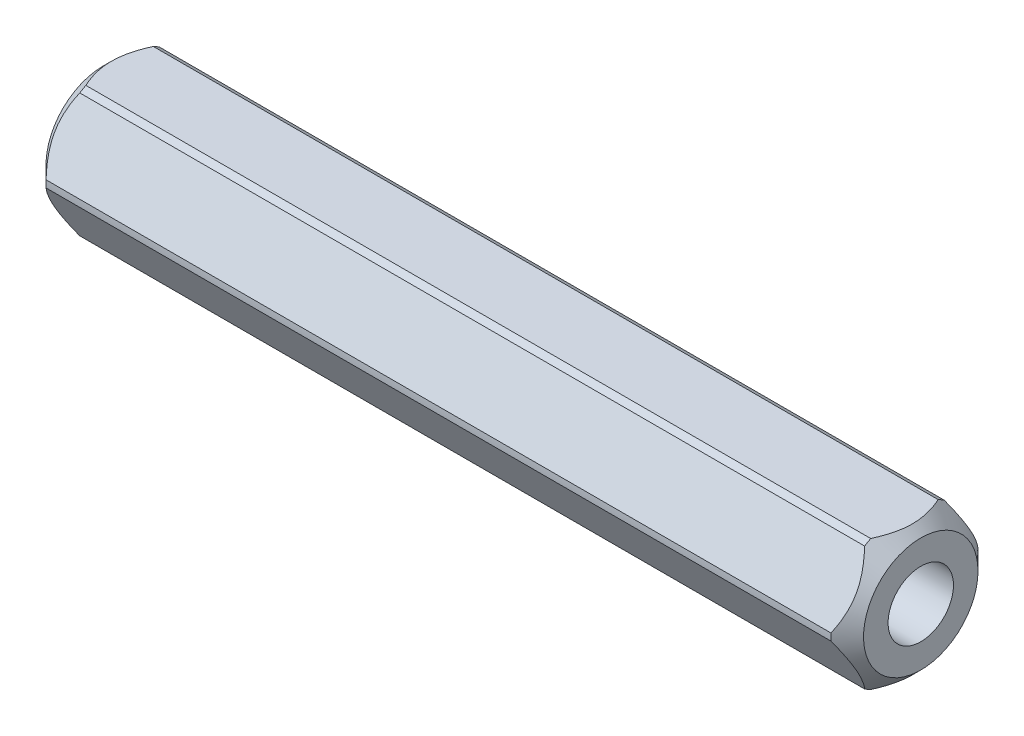
ISO-10303-21;
HEADER;
FILE_DESCRIPTION(('STEP AP214'),'2;1');
FILE_NAME('part.step','',(''),(''),'','','');
FILE_SCHEMA(('AUTOMOTIVE_DESIGN { 1 0 10303 214 1 1 1 1 }'));
ENDSEC;
DATA;
#1=APPLICATION_CONTEXT('core data for automotive mechanical design processes');
#2=APPLICATION_PROTOCOL_DEFINITION('international standard','automotive_design',2000,#1);
#3=PRODUCT_CONTEXT('',#1,'mechanical');
#4=PRODUCT('Part','Part','',(#3));
#5=PRODUCT_RELATED_PRODUCT_CATEGORY('part','',(#4));
#6=PRODUCT_DEFINITION_FORMATION('','',#4);
#7=PRODUCT_DEFINITION_CONTEXT('part definition',#1,'design');
#8=PRODUCT_DEFINITION('design','',#6,#7);
#9=PRODUCT_DEFINITION_SHAPE('','',#8);
#10=(LENGTH_UNIT() NAMED_UNIT(*) SI_UNIT(.MILLI.,.METRE.));
#11=(NAMED_UNIT(*) PLANE_ANGLE_UNIT() SI_UNIT($,.RADIAN.));
#12=(NAMED_UNIT(*) SI_UNIT($,.STERADIAN.) SOLID_ANGLE_UNIT());
#13=UNCERTAINTY_MEASURE_WITH_UNIT(LENGTH_MEASURE(1.E-05),#10,'distance_accuracy_value','');
#14=(GEOMETRIC_REPRESENTATION_CONTEXT(3) GLOBAL_UNCERTAINTY_ASSIGNED_CONTEXT((#13)) GLOBAL_UNIT_ASSIGNED_CONTEXT((#10,
#11,#12)) REPRESENTATION_CONTEXT('',''));
#15=CARTESIAN_POINT('',(0.,0.,0.));
#16=DIRECTION('',(0.,0.,1.));
#17=DIRECTION('',(1.,0.,0.));
#18=AXIS2_PLACEMENT_3D('',#15,#16,#17);
#19=CARTESIAN_POINT('',(25.,0.,0.));
#20=DIRECTION('',(1.,0.,0.));
#21=DIRECTION('',(0.,0.,-1.));
#22=AXIS2_PLACEMENT_3D('',#19,#20,#21);
#23=PLANE('',#22);
#24=CARTESIAN_POINT('',(25.,0.,0.));
#25=DIRECTION('',(1.,0.,0.));
#26=DIRECTION('',(0.,0.,-1.));
#27=AXIS2_PLACEMENT_3D('',#24,#25,#26);
#28=CIRCLE('',#27,2.);
#29=CARTESIAN_POINT('',(25.,0.,-2.));
#30=VERTEX_POINT('',#29);
#31=EDGE_CURVE('E190',#30,#30,#28,.T.);
#32=ORIENTED_EDGE('',*,*,#31,.F.);
#33=EDGE_LOOP('',(#32));
#34=FACE_BOUND('',#33,.T.);
#35=CARTESIAN_POINT('',(25.,0.,0.));
#36=DIRECTION('',(1.,0.,0.));
#37=DIRECTION('',(0.,0.,-1.));
#38=AXIS2_PLACEMENT_3D('',#35,#36,#37);
#39=CIRCLE('',#38,3.50000000000001);
#40=CARTESIAN_POINT('',(25.,0.,-3.50000000000001));
#41=VERTEX_POINT('',#40);
#42=EDGE_CURVE('E300',#41,#41,#39,.F.);
#43=ORIENTED_EDGE('',*,*,#42,.F.);
#44=EDGE_LOOP('',(#43));
#45=FACE_BOUND('',#44,.T.);
#46=ADVANCED_FACE('F34',(#34,#45),#23,.T.);
#47=CARTESIAN_POINT('',(-25.,0.,0.));
#48=DIRECTION('',(1.,0.,0.));
#49=DIRECTION('',(0.,0.,-1.));
#50=AXIS2_PLACEMENT_3D('',#47,#48,#49);
#51=PLANE('',#50);
#52=CARTESIAN_POINT('',(-25.,0.,0.));
#53=DIRECTION('',(1.,0.,0.));
#54=DIRECTION('',(0.,0.,-1.));
#55=AXIS2_PLACEMENT_3D('',#52,#53,#54);
#56=CIRCLE('',#55,3.5);
#57=CARTESIAN_POINT('',(-25.,0.,-3.5));
#58=VERTEX_POINT('',#57);
#59=EDGE_CURVE('E272',#58,#58,#56,.F.);
#60=ORIENTED_EDGE('',*,*,#59,.T.);
#61=EDGE_LOOP('',(#60));
#62=FACE_BOUND('',#61,.T.);
#63=CARTESIAN_POINT('',(-25.,0.,0.));
#64=DIRECTION('',(1.,0.,0.));
#65=DIRECTION('',(0.,0.,-1.));
#66=AXIS2_PLACEMENT_3D('',#63,#64,#65);
#67=CIRCLE('',#66,2.);
#68=CARTESIAN_POINT('',(-25.,0.,-2.));
#69=VERTEX_POINT('',#68);
#70=EDGE_CURVE('E187',#69,#69,#67,.T.);
#71=ORIENTED_EDGE('',*,*,#70,.T.);
#72=EDGE_LOOP('',(#71));
#73=FACE_BOUND('',#72,.T.);
#74=ADVANCED_FACE('F320',(#62,#73),#51,.F.);
#75=CARTESIAN_POINT('',(-25.,0.,0.));
#76=DIRECTION('',(1.,0.,0.));
#77=DIRECTION('',(0.,0.,-1.));
#78=AXIS2_PLACEMENT_3D('',#75,#76,#77);
#79=CYLINDRICAL_SURFACE('',#78,2.);
#80=ORIENTED_EDGE('',*,*,#70,.F.);
#81=EDGE_LOOP('',(#80));
#82=FACE_BOUND('',#81,.T.);
#83=ORIENTED_EDGE('',*,*,#31,.T.);
#84=EDGE_LOOP('',(#83));
#85=FACE_BOUND('',#84,.T.);
#86=ADVANCED_FACE('F339',(#82,#85),#79,.F.);
#87=CARTESIAN_POINT('',(24.,0.,0.));
#88=DIRECTION('',(-1.,0.,0.));
#89=DIRECTION('',(0.,0.,1.));
#90=AXIS2_PLACEMENT_3D('',#87,#88,#89);
#91=CONICAL_SURFACE('',#90,4.5,0.785398163397449);
#92=ORIENTED_EDGE('',*,*,#42,.T.);
#93=EDGE_LOOP('',(#92));
#94=FACE_BOUND('',#93,.T.);
#95=CARTESIAN_POINT('',(24.,0.,0.));
#96=DIRECTION('',(1.,0.,0.));
#97=DIRECTION('',(0.,0.,-1.));
#98=AXIS2_PLACEMENT_3D('',#95,#96,#97);
#99=CIRCLE('',#98,4.5);
#100=CARTESIAN_POINT('',(24.,-0.214642892864286,-4.49487802154217));
#101=VERTEX_POINT('',#100);
#102=CARTESIAN_POINT('',(24.,0.214642892864287,-4.49487802154217));
#103=VERTEX_POINT('',#102);
#104=EDGE_CURVE('E121',#101,#103,#99,.T.);
#105=ORIENTED_EDGE('',*,*,#104,.T.);
#106=CARTESIAN_POINT('',(23.9998941963782,3.78555710713571,-2.4332097386795));
#107=CARTESIAN_POINT('',(24.0664192825533,3.65976455759794,-2.50583610101718));
#108=CARTESIAN_POINT('',(24.1284859139684,3.53199462101411,-2.5796041082982));
#109=CARTESIAN_POINT('',(24.2410974501276,3.27212182868206,-2.72964173490617));
#110=CARTESIAN_POINT('',(24.2915930288924,3.14000307190182,-2.80592053469824));
#111=CARTESIAN_POINT('',(24.3772964035166,2.87383811958494,-2.95959094156723));
#112=CARTESIAN_POINT('',(24.4126929780641,2.73983876216137,-3.03695550664697));
#113=CARTESIAN_POINT('',(24.4663535308738,2.46946450383406,-3.19305615747418));
#114=CARTESIAN_POINT('',(24.4846469548417,2.33309409902488,-3.27178964740027));
#115=CARTESIAN_POINT('',(24.5018229694783,2.07015756383123,-3.42359612677411));
#116=CARTESIAN_POINT('',(24.5021148581694,1.94366093843834,-3.49662898749627));
#117=CARTESIAN_POINT('',(24.486790759109,1.69133917664634,-3.64230702458928));
#118=CARTESIAN_POINT('',(24.4711663583711,1.56551443074427,-3.71495197550656));
#119=CARTESIAN_POINT('',(24.4252415067076,1.31593556235903,-3.85904640235282));
#120=CARTESIAN_POINT('',(24.3949407378895,1.19218148478694,-3.93049585235238));
#121=CARTESIAN_POINT('',(24.3216820791155,0.947508545186826,-4.07175783989392));
#122=CARTESIAN_POINT('',(24.2787190677524,0.826590851776383,-4.14156970273423));
#123=CARTESIAN_POINT('',(24.1967021799686,0.623423612931695,-4.25886836277172));
#124=CARTESIAN_POINT('',(24.160279052702,0.540358783642004,-4.30682586432232));
#125=CARTESIAN_POINT('',(24.0831422190421,0.376095613933446,-4.40166324957149));
#126=CARTESIAN_POINT('',(24.0424451392451,0.294891435546449,-4.44854650382255));
#127=CARTESIAN_POINT('',(23.9998941963782,0.214442892864286,-4.49499349159601));
#128=B_SPLINE_CURVE_WITH_KNOTS('',3,(#106,#107,#108,#109,#110,#111,#112,#113,#114,#115,#116,
#117,#118,#119,#120,#121,#122,#123,#124,#125,#126,#127),.UNSPECIFIED.,.F.,.F.,(4,2,2,2,2,2,2,2,
2,2,4),(0.,0.479542803803612,0.961093310814039,1.43643287483049,1.91095255343955,
2.34827188801426,2.78582249958598,3.22338258899905,3.66111989867402,3.96880795536116,
4.27534051498786),.UNSPECIFIED.);
#129=CARTESIAN_POINT('',(24.,3.78535710713571,-2.43332520873334));
#130=VERTEX_POINT('',#129);
#131=EDGE_CURVE('E57',#130,#103,#128,.T.);
#132=ORIENTED_EDGE('',*,*,#131,.F.);
#133=CARTESIAN_POINT('',(24.,0.,0.));
#134=DIRECTION('',(-1.,0.,0.));
#135=DIRECTION('',(0.,0.,1.));
#136=AXIS2_PLACEMENT_3D('',#133,#134,#135);
#137=CIRCLE('',#136,4.5);
#138=CARTESIAN_POINT('',(24.,4.,-2.06155281280883));
#139=VERTEX_POINT('',#138);
#140=EDGE_CURVE('E43',#130,#139,#137,.F.);
#141=ORIENTED_EDGE('',*,*,#140,.T.);
#142=CARTESIAN_POINT('',(22.6928649035894,4.,-4.2098477440359));
#143=CARTESIAN_POINT('',(22.7683322571427,4.,-4.10572300635101));
#144=CARTESIAN_POINT('',(22.842955360482,4.,-4.00097607923509));
#145=CARTESIAN_POINT('',(22.9901526416945,4.,-3.7900108242579));
#146=CARTESIAN_POINT('',(23.0627262455372,4.,-3.68379209634703));
#147=CARTESIAN_POINT('',(23.2059640207921,4.,-3.4689003193544));
#148=CARTESIAN_POINT('',(23.2766094903172,4.,-3.36021475308562));
#149=CARTESIAN_POINT('',(23.4148896517596,4.,-3.14095359873995));
#150=CARTESIAN_POINT('',(23.482524567128,4.,-3.03037815178074));
#151=CARTESIAN_POINT('',(23.617180182585,4.,-2.80193387204831));
#152=CARTESIAN_POINT('',(23.6840300855366,4.,-2.68396328072187));
#153=CARTESIAN_POINT('',(23.8128070383945,4.,-2.44537436143938));
#154=CARTESIAN_POINT('',(23.8747334149841,4.,-2.32475567421149));
#155=CARTESIAN_POINT('',(24.0510992209669,4.,-1.95915644375599));
#156=CARTESIAN_POINT('',(24.1566367860336,4.,-1.70959580749333));
#157=CARTESIAN_POINT('',(24.2861804137904,4.,-1.33029830953283));
#158=CARTESIAN_POINT('',(24.3241322220595,4.,-1.20530239351173));
#159=CARTESIAN_POINT('',(24.3899388223468,4.,-0.952617592005227));
#160=CARTESIAN_POINT('',(24.4177928432462,4.,-0.824928501642774));
#161=CARTESIAN_POINT('',(24.4615756990499,4.,-0.569582108969877));
#162=CARTESIAN_POINT('',(24.4776869406595,4.,-0.44195652322617));
#163=CARTESIAN_POINT('',(24.4977250643249,4.,-0.185747621111381));
#164=CARTESIAN_POINT('',(24.5016533980343,4.,-0.0571644206751611));
#165=CARTESIAN_POINT('',(24.4971333329479,4.,0.1965341551888));
#166=CARTESIAN_POINT('',(24.4889943727593,4.,0.321655254534301));
#167=CARTESIAN_POINT('',(24.4613980492696,4.,0.570635147563651));
#168=CARTESIAN_POINT('',(24.4419394954324,4.,0.694493807076177));
#169=CARTESIAN_POINT('',(24.3923658437765,4.,0.942141035988629));
#170=CARTESIAN_POINT('',(24.3620813749865,4.,1.06589520999821));
#171=CARTESIAN_POINT('',(24.2923567428542,4.,1.31074172841007));
#172=CARTESIAN_POINT('',(24.2529177446344,4.,1.43183440940288));
#173=CARTESIAN_POINT('',(24.1588827297649,4.,1.69187261628163));
#174=CARTESIAN_POINT('',(24.1028455828701,4.,1.83029292838178));
#175=CARTESIAN_POINT('',(23.9823220956594,4.,2.10343753165063));
#176=CARTESIAN_POINT('',(23.9178315177235,4.,2.23815992785214));
#177=CARTESIAN_POINT('',(23.7819524607804,4.,2.50462598235461));
#178=CARTESIAN_POINT('',(23.7105414224704,4.,2.63635804473519));
#179=CARTESIAN_POINT('',(23.5624164043816,4.,2.8967558561299));
#180=CARTESIAN_POINT('',(23.4857033362368,4.,3.02542212718707));
#181=CARTESIAN_POINT('',(23.3320679810562,4.,3.27361014613941));
#182=CARTESIAN_POINT('',(23.2553567000029,4.,3.39326320403362));
#183=CARTESIAN_POINT('',(23.0988200514308,4.,3.6305215763458));
#184=CARTESIAN_POINT('',(23.0189944430863,4.,3.74812673138176));
#185=CARTESIAN_POINT('',(22.8574721996124,4.,3.9805856203557));
#186=CARTESIAN_POINT('',(22.7757967520329,4.,4.09545412864817));
#187=CARTESIAN_POINT('',(22.6103690712587,4.,4.32363990413772));
#188=CARTESIAN_POINT('',(22.5266174093984,4.,4.4369575850589));
#189=CARTESIAN_POINT('',(22.4420197526138,4.,4.54962907034432));
#190=B_SPLINE_CURVE_WITH_KNOTS('',3,(#142,#143,#144,#145,#146,#147,#148,#149,#150,#151,#152,
#153,#154,#155,#156,#157,#158,#159,#160,#161,#162,#163,#164,#165,#166,#167,#168,#169,#170,#171,
#172,#173,#174,#175,#176,#177,#178,#179,#180,#181,#182,#183,#184,#185,#186,#187,#188,#189),
.UNSPECIFIED.,.F.,.F.,(4,2,2,2,2,2,2,2,2,2,2,2,2,2,2,2,2,2,2,2,2,2,2,4),(0.,0.385800042062577,
0.771707089606285,1.16054681927145,1.54935763997496,1.95602118677923,2.36274025152729,
3.17324409248814,3.56480527962876,3.95639636209757,4.34176689179923,4.7270915009388,
5.10270467711247,5.47835736547435,5.86016465451193,6.24192337648311,6.68956044955975,
7.13742278295025,7.58679758555163,8.03609531370603,8.46243387400676,8.88880546795715,
9.31161701408836,9.73431347454803),.UNSPECIFIED.);
#191=CARTESIAN_POINT('',(24.,4.,2.06155281280883));
#192=VERTEX_POINT('',#191);
#193=EDGE_CURVE('E140',#192,#139,#190,.F.);
#194=ORIENTED_EDGE('',*,*,#193,.F.);
#195=CARTESIAN_POINT('',(24.,3.78535710713571,2.43332520873334));
#196=VERTEX_POINT('',#195);
#197=EDGE_CURVE('E131',#192,#196,#99,.T.);
#198=ORIENTED_EDGE('',*,*,#197,.T.);
#199=CARTESIAN_POINT('',(23.9998941963782,0.214442892864283,4.49499349159601));
#200=CARTESIAN_POINT('',(24.0664192825533,0.340235442402051,4.42236712925833));
#201=CARTESIAN_POINT('',(24.1284859139684,0.468005378985888,4.34859912197731));
#202=CARTESIAN_POINT('',(24.2410974501276,0.727878171317938,4.19856149536934));
#203=CARTESIAN_POINT('',(24.2915930288924,0.859996928098178,4.12228269557727));
#204=CARTESIAN_POINT('',(24.3772964035166,1.12616188041506,3.96861228870828));
#205=CARTESIAN_POINT('',(24.4126929780641,1.26016123783863,3.89124772362854));
#206=CARTESIAN_POINT('',(24.4663535308738,1.53053549616594,3.73514707280132));
#207=CARTESIAN_POINT('',(24.4846469548417,1.66690590097513,3.65641358287524));
#208=CARTESIAN_POINT('',(24.5018229694783,1.92984243616878,3.5046071035014));
#209=CARTESIAN_POINT('',(24.5021148581694,2.05633906156166,3.43157424277924));
#210=CARTESIAN_POINT('',(24.486790759109,2.30866082335366,3.28589620568622));
#211=CARTESIAN_POINT('',(24.4711663583711,2.43448556925574,3.21325125476895));
#212=CARTESIAN_POINT('',(24.4252415067076,2.68406443764098,3.06915682792269));
#213=CARTESIAN_POINT('',(24.3949407378895,2.80781851521307,2.99770737792313));
#214=CARTESIAN_POINT('',(24.3216820791155,3.05249145481318,2.85644539038158));
#215=CARTESIAN_POINT('',(24.2787190677524,3.17340914822362,2.78663352754128));
#216=CARTESIAN_POINT('',(24.1967021799686,3.37657638706831,2.66933486750378));
#217=CARTESIAN_POINT('',(24.160279052702,3.459641216358,2.62137736595319));
#218=CARTESIAN_POINT('',(24.0831422190421,3.62390438606655,2.52653998070402));
#219=CARTESIAN_POINT('',(24.0424451392451,3.70510856445355,2.47965672645296));
#220=CARTESIAN_POINT('',(23.9998941963782,3.78555710713571,2.4332097386795));
#221=B_SPLINE_CURVE_WITH_KNOTS('',3,(#199,#200,#201,#202,#203,#204,#205,#206,#207,#208,#209,
#210,#211,#212,#213,#214,#215,#216,#217,#218,#219,#220),.UNSPECIFIED.,.F.,.F.,(4,2,2,2,2,2,2,2,
2,2,4),(0.,0.479542803803613,0.961093310814043,1.4364328748305,1.91095255343956,
2.34827188801427,2.78582249958599,3.22338258899906,3.66111989867404,3.96880795536116,
4.27534051498786),.UNSPECIFIED.);
#222=CARTESIAN_POINT('',(24.,0.214642892864282,4.49487802154217));
#223=VERTEX_POINT('',#222);
#224=EDGE_CURVE('E164',#223,#196,#221,.T.);
#225=ORIENTED_EDGE('',*,*,#224,.F.);
#226=CARTESIAN_POINT('',(24.,-0.214642892864288,4.49487802154217));
#227=VERTEX_POINT('',#226);
#228=EDGE_CURVE('E295',#223,#227,#99,.T.);
#229=ORIENTED_EDGE('',*,*,#228,.T.);
#230=CARTESIAN_POINT('',(23.9998941963782,-3.78555710713571,2.4332097386795));
#231=CARTESIAN_POINT('',(24.0664192825533,-3.65976455759794,2.50583610101718));
#232=CARTESIAN_POINT('',(24.1284859139684,-3.53199462101411,2.5796041082982));
#233=CARTESIAN_POINT('',(24.2410974501275,-3.27212182868206,2.72964173490617));
#234=CARTESIAN_POINT('',(24.2915930288924,-3.14000307190182,2.80592053469824));
#235=CARTESIAN_POINT('',(24.3772964035166,-2.87383811958494,2.95959094156723));
#236=CARTESIAN_POINT('',(24.412692978064,-2.73983876216137,3.03695550664697));
#237=CARTESIAN_POINT('',(24.4663535308738,-2.46946450383406,3.19305615747419));
#238=CARTESIAN_POINT('',(24.4846469548417,-2.33309409902487,3.27178964740027));
#239=CARTESIAN_POINT('',(24.5018229694783,-2.07015756383122,3.42359612677411));
#240=CARTESIAN_POINT('',(24.5021148581694,-1.94366093843834,3.49662898749627));
#241=CARTESIAN_POINT('',(24.4867907591089,-1.69133917664633,3.64230702458928));
#242=CARTESIAN_POINT('',(24.4711663583711,-1.56551443074426,3.71495197550656));
#243=CARTESIAN_POINT('',(24.4252415067076,-1.31593556235902,3.85904640235282));
#244=CARTESIAN_POINT('',(24.3949407378895,-1.19218148478693,3.93049585235238));
#245=CARTESIAN_POINT('',(24.3216820791155,-0.947508545186819,4.07175783989393));
#246=CARTESIAN_POINT('',(24.2787190677524,-0.826590851776376,4.14156970273423));
#247=CARTESIAN_POINT('',(24.1967021799686,-0.623423612931689,4.25886836277173));
#248=CARTESIAN_POINT('',(24.160279052702,-0.540358783641999,4.30682586432232));
#249=CARTESIAN_POINT('',(24.0831422190421,-0.376095613933444,4.40166324957149));
#250=CARTESIAN_POINT('',(24.0424451392451,-0.294891435546448,4.44854650382255));
#251=CARTESIAN_POINT('',(23.9998941963782,-0.214442892864288,4.49499349159601));
#252=B_SPLINE_CURVE_WITH_KNOTS('',3,(#230,#231,#232,#233,#234,#235,#236,#237,#238,#239,#240,
#241,#242,#243,#244,#245,#246,#247,#248,#249,#250,#251),.UNSPECIFIED.,.F.,.F.,(4,2,2,2,2,2,2,2,
2,2,4),(0.,0.479542803803614,0.961093310814044,1.4364328748305,1.91095255343956,
2.34827188801427,2.78582249958599,3.22338258899906,3.66111989867404,3.96880795536116,
4.27534051498786),.UNSPECIFIED.);
#253=CARTESIAN_POINT('',(24.,-3.78535710713571,2.43332520873333));
#254=VERTEX_POINT('',#253);
#255=EDGE_CURVE('E310',#254,#227,#252,.T.);
#256=ORIENTED_EDGE('',*,*,#255,.F.);
#257=CARTESIAN_POINT('',(24.,-4.,2.06155281280882));
#258=VERTEX_POINT('',#257);
#259=EDGE_CURVE('E297',#254,#258,#99,.T.);
#260=ORIENTED_EDGE('',*,*,#259,.T.);
#261=CARTESIAN_POINT('',(22.6928649035894,-4.,-4.20984774403588));
#262=CARTESIAN_POINT('',(22.7683322571427,-4.,-4.105723006351));
#263=CARTESIAN_POINT('',(22.842955360482,-4.,-4.00097607923507));
#264=CARTESIAN_POINT('',(22.9901526416945,-4.,-3.79001082425789));
#265=CARTESIAN_POINT('',(23.0627262455372,-4.,-3.68379209634702));
#266=CARTESIAN_POINT('',(23.2059640207921,-4.,-3.46890031935439));
#267=CARTESIAN_POINT('',(23.2766094903172,-4.,-3.36021475308561));
#268=CARTESIAN_POINT('',(23.4148896517596,-4.,-3.14095359873994));
#269=CARTESIAN_POINT('',(23.482524567128,-4.,-3.03037815178073));
#270=CARTESIAN_POINT('',(23.617180182585,-4.,-2.80193387204829));
#271=CARTESIAN_POINT('',(23.6840300855366,-4.,-2.68396328072186));
#272=CARTESIAN_POINT('',(23.8128070383945,-4.,-2.44537436143937));
#273=CARTESIAN_POINT('',(23.8747334149841,-4.,-2.32475567421148));
#274=CARTESIAN_POINT('',(24.0510992209669,-4.,-1.95915644375599));
#275=CARTESIAN_POINT('',(24.1566367860336,-4.,-1.70959580749332));
#276=CARTESIAN_POINT('',(24.2861804137904,-4.,-1.33029830953283));
#277=CARTESIAN_POINT('',(24.3241322220595,-4.,-1.20530239351172));
#278=CARTESIAN_POINT('',(24.3899388223468,-4.,-0.952617592005224));
#279=CARTESIAN_POINT('',(24.4177928432462,-4.,-0.82492850164277));
#280=CARTESIAN_POINT('',(24.4615756990499,-4.,-0.569582108969872));
#281=CARTESIAN_POINT('',(24.4776869406595,-4.,-0.441956523226166));
#282=CARTESIAN_POINT('',(24.4977250643249,-4.,-0.185747621111377));
#283=CARTESIAN_POINT('',(24.5016533980343,-4.,-0.057164420675157));
#284=CARTESIAN_POINT('',(24.4971333329479,-4.,0.196534155188803));
#285=CARTESIAN_POINT('',(24.4889943727592,-4.,0.321655254534304));
#286=CARTESIAN_POINT('',(24.4613980492696,-4.,0.570635147563655));
#287=CARTESIAN_POINT('',(24.4419394954324,-4.,0.694493807076181));
#288=CARTESIAN_POINT('',(24.3923658437765,-4.,0.942141035988633));
#289=CARTESIAN_POINT('',(24.3620813749865,-4.,1.06589520999821));
#290=CARTESIAN_POINT('',(24.2923567428542,-4.,1.31074172841007));
#291=CARTESIAN_POINT('',(24.2529177446344,-4.,1.43183440940289));
#292=CARTESIAN_POINT('',(24.1588827297649,-4.,1.69187261628163));
#293=CARTESIAN_POINT('',(24.1028455828701,-4.,1.83029292838179));
#294=CARTESIAN_POINT('',(23.9823220956594,-4.,2.10343753165063));
#295=CARTESIAN_POINT('',(23.9178315177234,-4.,2.23815992785214));
#296=CARTESIAN_POINT('',(23.7819524607804,-4.,2.50462598235461));
#297=CARTESIAN_POINT('',(23.7105414224704,-4.,2.63635804473519));
#298=CARTESIAN_POINT('',(23.5624164043816,-4.,2.89675585612991));
#299=CARTESIAN_POINT('',(23.4857033362368,-4.,3.02542212718708));
#300=CARTESIAN_POINT('',(23.3320679810562,-4.,3.27361014613942));
#301=CARTESIAN_POINT('',(23.2553567000029,-4.,3.39326320403363));
#302=CARTESIAN_POINT('',(23.0988200514308,-4.,3.63052157634581));
#303=CARTESIAN_POINT('',(23.0189944430863,-4.,3.74812673138178));
#304=CARTESIAN_POINT('',(22.8574721996124,-4.,3.98058562035571));
#305=CARTESIAN_POINT('',(22.7757967520329,-4.,4.09545412864819));
#306=CARTESIAN_POINT('',(22.6103690712587,-4.,4.32363990413774));
#307=CARTESIAN_POINT('',(22.5266174093983,-4.,4.43695758505892));
#308=CARTESIAN_POINT('',(22.4420197526137,-4.,4.54962907034433));
#309=B_SPLINE_CURVE_WITH_KNOTS('',3,(#261,#262,#263,#264,#265,#266,#267,#268,#269,#270,#271,
#272,#273,#274,#275,#276,#277,#278,#279,#280,#281,#282,#283,#284,#285,#286,#287,#288,#289,#290,
#291,#292,#293,#294,#295,#296,#297,#298,#299,#300,#301,#302,#303,#304,#305,#306,#307,#308),
.UNSPECIFIED.,.F.,.F.,(4,2,2,2,2,2,2,2,2,2,2,2,2,2,2,2,2,2,2,2,2,2,2,4),(0.,0.385800042062574,
0.771707089606282,1.16054681927145,1.54935763997495,1.95602118677923,2.36274025152728,
3.17324409248813,3.56480527962875,3.95639636209755,4.34176689179922,4.72709150093878,
5.10270467711246,5.47835736547434,5.86016465451192,6.2419233764831,6.68956044955974,
7.13742278295024,7.58679758555162,8.03609531370602,8.46243387400676,8.88880546795715,
9.31161701408837,9.73431347454803),.UNSPECIFIED.);
#310=CARTESIAN_POINT('',(24.,-3.99999999999999,-2.06155281280882));
#311=VERTEX_POINT('',#310);
#312=EDGE_CURVE('E303',#311,#258,#309,.T.);
#313=ORIENTED_EDGE('',*,*,#312,.F.);
#314=CARTESIAN_POINT('',(24.,-3.7853571071357,-2.43332520873334));
#315=VERTEX_POINT('',#314);
#316=EDGE_CURVE('E129',#311,#315,#99,.T.);
#317=ORIENTED_EDGE('',*,*,#316,.T.);
#318=CARTESIAN_POINT('',(23.9998941963782,-0.214442892864287,-4.49499349159601));
#319=CARTESIAN_POINT('',(24.0664192825533,-0.340235442402055,-4.42236712925833));
#320=CARTESIAN_POINT('',(24.1284859139684,-0.468005378985891,-4.34859912197731));
#321=CARTESIAN_POINT('',(24.2410974501276,-0.727878171317939,-4.19856149536934));
#322=CARTESIAN_POINT('',(24.2915930288924,-0.859996928098178,-4.12228269557727));
#323=CARTESIAN_POINT('',(24.3772964035166,-1.12616188041506,-3.96861228870828));
#324=CARTESIAN_POINT('',(24.412692978064,-1.26016123783863,-3.89124772362854));
#325=CARTESIAN_POINT('',(24.4663535308738,-1.53053549616594,-3.73514707280132));
#326=CARTESIAN_POINT('',(24.4846469548417,-1.66690590097512,-3.65641358287524));
#327=CARTESIAN_POINT('',(24.5018229694783,-1.92984243616877,-3.5046071035014));
#328=CARTESIAN_POINT('',(24.5021148581694,-2.05633906156165,-3.43157424277924));
#329=CARTESIAN_POINT('',(24.4867907591089,-2.30866082335366,-3.28589620568623));
#330=CARTESIAN_POINT('',(24.4711663583711,-2.43448556925573,-3.21325125476895));
#331=CARTESIAN_POINT('',(24.4252415067076,-2.68406443764097,-3.06915682792269));
#332=CARTESIAN_POINT('',(24.3949407378895,-2.80781851521306,-2.99770737792313));
#333=CARTESIAN_POINT('',(24.3216820791155,-3.05249145481317,-2.85644539038159));
#334=CARTESIAN_POINT('',(24.2787190677524,-3.17340914822362,-2.78663352754128));
#335=CARTESIAN_POINT('',(24.1967021799686,-3.37657638706831,-2.66933486750379));
#336=CARTESIAN_POINT('',(24.160279052702,-3.459641216358,-2.62137736595319));
#337=CARTESIAN_POINT('',(24.0831422190421,-3.62390438606655,-2.52653998070402));
#338=CARTESIAN_POINT('',(24.0424451392451,-3.70510856445355,-2.47965672645296));
#339=CARTESIAN_POINT('',(23.9998941963782,-3.78555710713571,-2.43320973867951));
#340=B_SPLINE_CURVE_WITH_KNOTS('',3,(#318,#319,#320,#321,#322,#323,#324,#325,#326,#327,#328,
#329,#330,#331,#332,#333,#334,#335,#336,#337,#338,#339),.UNSPECIFIED.,.F.,.F.,(4,2,2,2,2,2,2,2,
2,2,4),(0.,0.479542803803611,0.961093310814037,1.43643287483049,1.91095255343955,
2.34827188801426,2.78582249958598,3.22338258899905,3.66111989867402,3.96880795536116,
4.27534051498785),.UNSPECIFIED.);
#341=EDGE_CURVE('E124',#101,#315,#340,.T.);
#342=ORIENTED_EDGE('',*,*,#341,.F.);
#343=EDGE_LOOP('',(#105,#132,#141,#194,#198,#225,#229,#256,#260,#313,#317,#342));
#344=FACE_BOUND('',#343,.T.);
#345=ADVANCED_FACE('F122',(#94,#344),#91,.T.);
#346=CARTESIAN_POINT('',(-25.5,0.,0.));
#347=DIRECTION('',(1.,0.,0.));
#348=DIRECTION('',(0.,0.,-1.));
#349=AXIS2_PLACEMENT_3D('',#346,#347,#348);
#350=CONICAL_SURFACE('',#349,3.,0.785398163397448);
#351=ORIENTED_EDGE('',*,*,#59,.F.);
#352=EDGE_LOOP('',(#351));
#353=FACE_BOUND('',#352,.T.);
#354=CARTESIAN_POINT('',(-24.,0.,0.));
#355=DIRECTION('',(1.,0.,0.));
#356=DIRECTION('',(0.,0.,-1.));
#357=AXIS2_PLACEMENT_3D('',#354,#355,#356);
#358=CIRCLE('',#357,4.5);
#359=CARTESIAN_POINT('',(-24.,-3.99999999999999,-2.06155281280882));
#360=VERTEX_POINT('',#359);
#361=CARTESIAN_POINT('',(-24.,-3.7853571071357,-2.43332520873334));
#362=VERTEX_POINT('',#361);
#363=EDGE_CURVE('E439',#360,#362,#358,.T.);
#364=ORIENTED_EDGE('',*,*,#363,.F.);
#365=CARTESIAN_POINT('',(-22.6928649035894,-4.,-4.20984774403587));
#366=CARTESIAN_POINT('',(-22.7683322571426,-4.,-4.10572300635099));
#367=CARTESIAN_POINT('',(-22.842955360482,-4.,-4.00097607923506));
#368=CARTESIAN_POINT('',(-22.9901526416945,-4.,-3.79001082425788));
#369=CARTESIAN_POINT('',(-23.0627262455371,-4.,-3.68379209634701));
#370=CARTESIAN_POINT('',(-23.2059640207921,-4.,-3.46890031935438));
#371=CARTESIAN_POINT('',(-23.2766094903172,-4.,-3.3602147530856));
#372=CARTESIAN_POINT('',(-23.4148896517596,-4.,-3.14095359873993));
#373=CARTESIAN_POINT('',(-23.482524567128,-4.,-3.03037815178072));
#374=CARTESIAN_POINT('',(-23.617180182585,-4.,-2.80193387204829));
#375=CARTESIAN_POINT('',(-23.6840300855366,-4.,-2.68396328072185));
#376=CARTESIAN_POINT('',(-23.8128070383945,-4.,-2.44537436143936));
#377=CARTESIAN_POINT('',(-23.8747334149841,-4.,-2.32475567421148));
#378=CARTESIAN_POINT('',(-24.0510992209669,-4.,-1.95915644375598));
#379=CARTESIAN_POINT('',(-24.1566367860336,-4.,-1.70959580749332));
#380=CARTESIAN_POINT('',(-24.2861804137903,-4.,-1.33029830953283));
#381=CARTESIAN_POINT('',(-24.3241322220595,-4.,-1.20530239351172));
#382=CARTESIAN_POINT('',(-24.3899388223468,-4.,-0.952617592005223));
#383=CARTESIAN_POINT('',(-24.4177928432461,-4.,-0.82492850164277));
#384=CARTESIAN_POINT('',(-24.4615756990499,-4.,-0.569582108969872));
#385=CARTESIAN_POINT('',(-24.4776869406595,-4.,-0.441956523226166));
#386=CARTESIAN_POINT('',(-24.4977250643249,-4.,-0.185747621111377));
#387=CARTESIAN_POINT('',(-24.5016533980343,-4.,-0.0571644206751577));
#388=CARTESIAN_POINT('',(-24.4971333329479,-4.,0.196534155188802));
#389=CARTESIAN_POINT('',(-24.4889943727592,-4.,0.321655254534303));
#390=CARTESIAN_POINT('',(-24.4613980492695,-4.,0.570635147563653));
#391=CARTESIAN_POINT('',(-24.4419394954324,-4.,0.694493807076179));
#392=CARTESIAN_POINT('',(-24.3923658437765,-4.,0.94214103598863));
#393=CARTESIAN_POINT('',(-24.3620813749865,-4.,1.06589520999821));
#394=CARTESIAN_POINT('',(-24.2923567428541,-4.,1.31074172841007));
#395=CARTESIAN_POINT('',(-24.2529177446344,-4.,1.43183440940288));
#396=CARTESIAN_POINT('',(-24.1588827297649,-4.,1.69187261628163));
#397=CARTESIAN_POINT('',(-24.1028455828701,-4.,1.83029292838178));
#398=CARTESIAN_POINT('',(-23.9823220956594,-4.,2.10343753165063));
#399=CARTESIAN_POINT('',(-23.9178315177234,-4.,2.23815992785214));
#400=CARTESIAN_POINT('',(-23.7819524607804,-4.,2.5046259823546));
#401=CARTESIAN_POINT('',(-23.7105414224703,-4.,2.63635804473518));
#402=CARTESIAN_POINT('',(-23.5624164043816,-4.,2.8967558561299));
#403=CARTESIAN_POINT('',(-23.4857033362368,-4.,3.02542212718707));
#404=CARTESIAN_POINT('',(-23.3320679810562,-4.,3.27361014613941));
#405=CARTESIAN_POINT('',(-23.2553567000029,-4.,3.39326320403362));
#406=CARTESIAN_POINT('',(-23.0988200514308,-4.,3.6305215763458));
#407=CARTESIAN_POINT('',(-23.0189944430863,-4.,3.74812673138176));
#408=CARTESIAN_POINT('',(-22.8574721996124,-4.,3.9805856203557));
#409=CARTESIAN_POINT('',(-22.7757967520329,-4.,4.09545412864817));
#410=CARTESIAN_POINT('',(-22.6103690712587,-4.,4.32363990413772));
#411=CARTESIAN_POINT('',(-22.5266174093983,-4.,4.4369575850589));
#412=CARTESIAN_POINT('',(-22.4420197526137,-4.,4.54962907034431));
#413=B_SPLINE_CURVE_WITH_KNOTS('',3,(#365,#366,#367,#368,#369,#370,#371,#372,#373,#374,#375,
#376,#377,#378,#379,#380,#381,#382,#383,#384,#385,#386,#387,#388,#389,#390,#391,#392,#393,#394,
#395,#396,#397,#398,#399,#400,#401,#402,#403,#404,#405,#406,#407,#408,#409,#410,#411,#412),
.UNSPECIFIED.,.F.,.F.,(4,2,2,2,2,2,2,2,2,2,2,2,2,2,2,2,2,2,2,2,2,2,2,4),(0.,0.385800042062576,
0.771707089606285,1.16054681927145,1.54935763997495,1.95602118677923,2.36274025152727,
3.17324409248812,3.56480527962874,3.95639636209754,4.34176689179921,4.72709150093877,
5.10270467711245,5.47835736547433,5.8601646545119,6.24192337648308,6.68956044955972,
7.13742278295022,7.5867975855516,8.036095313706,8.46243387400673,8.88880546795712,
9.31161701408834,9.734313474548),.UNSPECIFIED.);
#414=CARTESIAN_POINT('',(-24.,-4.,2.06155281280882));
#415=VERTEX_POINT('',#414);
#416=EDGE_CURVE('E218',#415,#360,#413,.F.);
#417=ORIENTED_EDGE('',*,*,#416,.F.);
#418=CARTESIAN_POINT('',(-24.,-3.78535710713571,2.43332520873333));
#419=VERTEX_POINT('',#418);
#420=EDGE_CURVE('E440',#419,#415,#358,.T.);
#421=ORIENTED_EDGE('',*,*,#420,.F.);
#422=CARTESIAN_POINT('',(-23.9998941963782,-0.214442892864289,4.49499349159601));
#423=CARTESIAN_POINT('',(-24.0664192825533,-0.340235442402056,4.42236712925833));
#424=CARTESIAN_POINT('',(-24.1284859139684,-0.468005378985892,4.34859912197731));
#425=CARTESIAN_POINT('',(-24.2410974501275,-0.727878171317941,4.19856149536934));
#426=CARTESIAN_POINT('',(-24.2915930288924,-0.859996928098182,4.12228269557727));
#427=CARTESIAN_POINT('',(-24.3772964035166,-1.12616188041506,3.96861228870828));
#428=CARTESIAN_POINT('',(-24.412692978064,-1.26016123783863,3.89124772362854));
#429=CARTESIAN_POINT('',(-24.4663535308738,-1.53053549616594,3.73514707280132));
#430=CARTESIAN_POINT('',(-24.4846469548417,-1.66690590097512,3.65641358287524));
#431=CARTESIAN_POINT('',(-24.5018229694782,-1.92984243616877,3.5046071035014));
#432=CARTESIAN_POINT('',(-24.5021148581694,-2.05633906156165,3.43157424277924));
#433=CARTESIAN_POINT('',(-24.4867907591089,-2.30866082335366,3.28589620568623));
#434=CARTESIAN_POINT('',(-24.4711663583711,-2.43448556925573,3.21325125476895));
#435=CARTESIAN_POINT('',(-24.4252415067076,-2.68406443764097,3.06915682792269));
#436=CARTESIAN_POINT('',(-24.3949407378895,-2.80781851521306,2.99770737792313));
#437=CARTESIAN_POINT('',(-24.3216820791155,-3.05249145481317,2.85644539038159));
#438=CARTESIAN_POINT('',(-24.2787190677523,-3.17340914822362,2.78663352754128));
#439=CARTESIAN_POINT('',(-24.1967021799686,-3.3765763870683,2.66933486750379));
#440=CARTESIAN_POINT('',(-24.160279052702,-3.459641216358,2.62137736595319));
#441=CARTESIAN_POINT('',(-24.0831422190421,-3.62390438606655,2.52653998070401));
#442=CARTESIAN_POINT('',(-24.0424451392451,-3.70510856445355,2.47965672645296));
#443=CARTESIAN_POINT('',(-23.9998941963782,-3.78555710713571,2.4332097386795));
#444=B_SPLINE_CURVE_WITH_KNOTS('',3,(#422,#423,#424,#425,#426,#427,#428,#429,#430,#431,#432,
#433,#434,#435,#436,#437,#438,#439,#440,#441,#442,#443),.UNSPECIFIED.,.F.,.F.,(4,2,2,2,2,2,2,2,
2,2,4),(0.,0.479542803803611,0.961093310814039,1.43643287483049,1.91095255343955,
2.34827188801426,2.78582249958598,3.22338258899905,3.66111989867402,3.96880795536116,
4.27534051498786),.UNSPECIFIED.);
#445=CARTESIAN_POINT('',(-24.,-0.214642892864288,4.49487802154217));
#446=VERTEX_POINT('',#445);
#447=EDGE_CURVE('E228',#446,#419,#444,.T.);
#448=ORIENTED_EDGE('',*,*,#447,.F.);
#449=CARTESIAN_POINT('',(-24.,0.214642892864282,4.49487802154217));
#450=VERTEX_POINT('',#449);
#451=EDGE_CURVE('E294',#450,#446,#358,.T.);
#452=ORIENTED_EDGE('',*,*,#451,.F.);
#453=CARTESIAN_POINT('',(-23.9998941963782,3.78555710713571,2.4332097386795));
#454=CARTESIAN_POINT('',(-24.0664192825533,3.65976455759794,2.50583610101718));
#455=CARTESIAN_POINT('',(-24.1284859139684,3.53199462101411,2.5796041082982));
#456=CARTESIAN_POINT('',(-24.2410974501275,3.27212182868206,2.72964173490617));
#457=CARTESIAN_POINT('',(-24.2915930288924,3.14000307190182,2.80592053469824));
#458=CARTESIAN_POINT('',(-24.3772964035166,2.87383811958494,2.95959094156723));
#459=CARTESIAN_POINT('',(-24.412692978064,2.73983876216137,3.03695550664697));
#460=CARTESIAN_POINT('',(-24.4663535308738,2.46946450383406,3.19305615747419));
#461=CARTESIAN_POINT('',(-24.4846469548417,2.33309409902488,3.27178964740027));
#462=CARTESIAN_POINT('',(-24.5018229694782,2.07015756383123,3.42359612677411));
#463=CARTESIAN_POINT('',(-24.5021148581694,1.94366093843834,3.49662898749627));
#464=CARTESIAN_POINT('',(-24.4867907591089,1.69133917664634,3.64230702458928));
#465=CARTESIAN_POINT('',(-24.4711663583711,1.56551443074427,3.71495197550656));
#466=CARTESIAN_POINT('',(-24.4252415067076,1.31593556235903,3.85904640235282));
#467=CARTESIAN_POINT('',(-24.3949407378895,1.19218148478694,3.93049585235238));
#468=CARTESIAN_POINT('',(-24.3216820791155,0.947508545186824,4.07175783989392));
#469=CARTESIAN_POINT('',(-24.2787190677524,0.826590851776383,4.14156970273423));
#470=CARTESIAN_POINT('',(-24.1967021799686,0.623423612931694,4.25886836277172));
#471=CARTESIAN_POINT('',(-24.160279052702,0.540358783642001,4.30682586432231));
#472=CARTESIAN_POINT('',(-24.0831422190421,0.376095613933442,4.40166324957149));
#473=CARTESIAN_POINT('',(-24.0424451392451,0.294891435546444,4.44854650382255));
#474=CARTESIAN_POINT('',(-23.9998941963782,0.214442892864283,4.49499349159601));
#475=B_SPLINE_CURVE_WITH_KNOTS('',3,(#453,#454,#455,#456,#457,#458,#459,#460,#461,#462,#463,
#464,#465,#466,#467,#468,#469,#470,#471,#472,#473,#474),.UNSPECIFIED.,.F.,.F.,(4,2,2,2,2,2,2,2,
2,2,4),(0.,0.479542803803611,0.961093310814039,1.43643287483049,1.91095255343955,
2.34827188801426,2.78582249958598,3.22338258899905,3.66111989867402,3.96880795536116,
4.27534051498786),.UNSPECIFIED.);
#476=CARTESIAN_POINT('',(-24.,3.78535710713571,2.43332520873334));
#477=VERTEX_POINT('',#476);
#478=EDGE_CURVE('E236',#477,#450,#475,.T.);
#479=ORIENTED_EDGE('',*,*,#478,.F.);
#480=CARTESIAN_POINT('',(-24.,4.,2.06155281280883));
#481=VERTEX_POINT('',#480);
#482=EDGE_CURVE('E304',#481,#477,#358,.T.);
#483=ORIENTED_EDGE('',*,*,#482,.F.);
#484=CARTESIAN_POINT('',(-22.6928649035894,4.,-4.20984774403589));
#485=CARTESIAN_POINT('',(-22.7683322571426,4.,-4.105723006351));
#486=CARTESIAN_POINT('',(-22.842955360482,4.,-4.00097607923508));
#487=CARTESIAN_POINT('',(-22.9901526416945,4.,-3.79001082425789));
#488=CARTESIAN_POINT('',(-23.0627262455371,4.,-3.68379209634702));
#489=CARTESIAN_POINT('',(-23.2059640207921,4.,-3.46890031935439));
#490=CARTESIAN_POINT('',(-23.2766094903172,4.,-3.36021475308561));
#491=CARTESIAN_POINT('',(-23.4148896517596,4.,-3.14095359873994));
#492=CARTESIAN_POINT('',(-23.482524567128,4.,-3.03037815178073));
#493=CARTESIAN_POINT('',(-23.617180182585,4.,-2.8019338720483));
#494=CARTESIAN_POINT('',(-23.6840300855366,4.,-2.68396328072186));
#495=CARTESIAN_POINT('',(-23.8128070383945,4.,-2.44537436143937));
#496=CARTESIAN_POINT('',(-23.8747334149841,4.,-2.32475567421148));
#497=CARTESIAN_POINT('',(-24.0510992209669,4.,-1.95915644375599));
#498=CARTESIAN_POINT('',(-24.1566367860336,4.,-1.70959580749333));
#499=CARTESIAN_POINT('',(-24.2861804137904,4.,-1.33029830953283));
#500=CARTESIAN_POINT('',(-24.3241322220595,4.,-1.20530239351173));
#501=CARTESIAN_POINT('',(-24.3899388223468,4.,-0.952617592005226));
#502=CARTESIAN_POINT('',(-24.4177928432462,4.,-0.824928501642774));
#503=CARTESIAN_POINT('',(-24.4615756990499,4.,-0.569582108969876));
#504=CARTESIAN_POINT('',(-24.4776869406595,4.,-0.44195652322617));
#505=CARTESIAN_POINT('',(-24.4977250643249,4.,-0.185747621111382));
#506=CARTESIAN_POINT('',(-24.5016533980343,4.,-0.0571644206751632));
#507=CARTESIAN_POINT('',(-24.4971333329479,4.,0.196534155188796));
#508=CARTESIAN_POINT('',(-24.4889943727592,4.,0.321655254534297));
#509=CARTESIAN_POINT('',(-24.4613980492696,4.,0.570635147563647));
#510=CARTESIAN_POINT('',(-24.4419394954324,4.,0.694493807076172));
#511=CARTESIAN_POINT('',(-24.3923658437765,4.,0.942141035988623));
#512=CARTESIAN_POINT('',(-24.3620813749865,4.,1.0658952099982));
#513=CARTESIAN_POINT('',(-24.2923567428542,4.,1.31074172841006));
#514=CARTESIAN_POINT('',(-24.2529177446344,4.,1.43183440940287));
#515=CARTESIAN_POINT('',(-24.1588827297649,4.,1.69187261628162));
#516=CARTESIAN_POINT('',(-24.1028455828701,4.,1.83029292838177));
#517=CARTESIAN_POINT('',(-23.9823220956594,4.,2.10343753165062));
#518=CARTESIAN_POINT('',(-23.9178315177234,4.,2.23815992785212));
#519=CARTESIAN_POINT('',(-23.7819524607804,4.,2.50462598235459));
#520=CARTESIAN_POINT('',(-23.7105414224704,4.,2.63635804473517));
#521=CARTESIAN_POINT('',(-23.5624164043816,4.,2.89675585612988));
#522=CARTESIAN_POINT('',(-23.4857033362368,4.,3.02542212718705));
#523=CARTESIAN_POINT('',(-23.3320679810562,4.,3.27361014613939));
#524=CARTESIAN_POINT('',(-23.2553567000029,4.,3.3932632040336));
#525=CARTESIAN_POINT('',(-23.0988200514308,4.,3.63052157634578));
#526=CARTESIAN_POINT('',(-23.0189944430863,4.,3.74812673138174));
#527=CARTESIAN_POINT('',(-22.8574721996124,4.,3.98058562035568));
#528=CARTESIAN_POINT('',(-22.7757967520329,4.,4.09545412864815));
#529=CARTESIAN_POINT('',(-22.6103690712587,4.,4.3236399041377));
#530=CARTESIAN_POINT('',(-22.5266174093984,4.,4.43695758505888));
#531=CARTESIAN_POINT('',(-22.4420197526138,4.,4.54962907034429));
#532=B_SPLINE_CURVE_WITH_KNOTS('',3,(#484,#485,#486,#487,#488,#489,#490,#491,#492,#493,#494,
#495,#496,#497,#498,#499,#500,#501,#502,#503,#504,#505,#506,#507,#508,#509,#510,#511,#512,#513,
#514,#515,#516,#517,#518,#519,#520,#521,#522,#523,#524,#525,#526,#527,#528,#529,#530,#531),
.UNSPECIFIED.,.F.,.F.,(4,2,2,2,2,2,2,2,2,2,2,2,2,2,2,2,2,2,2,2,2,2,2,4),(0.,0.385800042062577,
0.771707089606284,1.16054681927146,1.54935763997496,1.95602118677923,2.36274025152728,
3.17324409248814,3.56480527962875,3.95639636209756,4.34176689179922,4.72709150093878,
5.10270467711246,5.47835736547434,5.86016465451191,6.24192337648309,6.68956044955973,
7.13742278295023,7.5867975855516,8.036095313706,8.46243387400673,8.88880546795712,
9.31161701408833,9.73431347454799),.UNSPECIFIED.);
#533=CARTESIAN_POINT('',(-24.,4.,-2.06155281280883));
#534=VERTEX_POINT('',#533);
#535=EDGE_CURVE('E49',#534,#481,#532,.T.);
#536=ORIENTED_EDGE('',*,*,#535,.F.);
#537=CARTESIAN_POINT('',(-24.,0.,0.));
#538=DIRECTION('',(1.,0.,0.));
#539=DIRECTION('',(0.,0.,-1.));
#540=AXIS2_PLACEMENT_3D('',#537,#538,#539);
#541=CIRCLE('',#540,4.5);
#542=CARTESIAN_POINT('',(-24.,3.78535710713571,-2.43332520873334));
#543=VERTEX_POINT('',#542);
#544=EDGE_CURVE('E11',#534,#543,#541,.F.);
#545=ORIENTED_EDGE('',*,*,#544,.T.);
#546=CARTESIAN_POINT('',(-23.9998941963782,0.214442892864287,-4.49499349159601));
#547=CARTESIAN_POINT('',(-24.0664192825533,0.340235442402055,-4.42236712925833));
#548=CARTESIAN_POINT('',(-24.1284859139684,0.468005378985892,-4.34859912197731));
#549=CARTESIAN_POINT('',(-24.2410974501275,0.727878171317941,-4.19856149536934));
#550=CARTESIAN_POINT('',(-24.2915930288924,0.85999692809818,-4.12228269557727));
#551=CARTESIAN_POINT('',(-24.3772964035166,1.12616188041506,-3.96861228870828));
#552=CARTESIAN_POINT('',(-24.412692978064,1.26016123783863,-3.89124772362854));
#553=CARTESIAN_POINT('',(-24.4663535308738,1.53053549616594,-3.73514707280132));
#554=CARTESIAN_POINT('',(-24.4846469548417,1.66690590097512,-3.65641358287524));
#555=CARTESIAN_POINT('',(-24.5018229694782,1.92984243616877,-3.5046071035014));
#556=CARTESIAN_POINT('',(-24.5021148581694,2.05633906156166,-3.43157424277924));
#557=CARTESIAN_POINT('',(-24.4867907591089,2.30866082335366,-3.28589620568623));
#558=CARTESIAN_POINT('',(-24.4711663583711,2.43448556925573,-3.21325125476895));
#559=CARTESIAN_POINT('',(-24.4252415067076,2.68406443764097,-3.06915682792269));
#560=CARTESIAN_POINT('',(-24.3949407378895,2.80781851521306,-2.99770737792313));
#561=CARTESIAN_POINT('',(-24.3216820791155,3.05249145481318,-2.85644539038159));
#562=CARTESIAN_POINT('',(-24.2787190677524,3.17340914822362,-2.78663352754128));
#563=CARTESIAN_POINT('',(-24.1967021799686,3.37657638706831,-2.66933486750378));
#564=CARTESIAN_POINT('',(-24.160279052702,3.459641216358,-2.62137736595319));
#565=CARTESIAN_POINT('',(-24.0831422190421,3.62390438606656,-2.52653998070401));
#566=CARTESIAN_POINT('',(-24.0424451392451,3.70510856445355,-2.47965672645296));
#567=CARTESIAN_POINT('',(-23.9998941963782,3.78555710713571,-2.4332097386795));
#568=B_SPLINE_CURVE_WITH_KNOTS('',3,(#546,#547,#548,#549,#550,#551,#552,#553,#554,#555,#556,
#557,#558,#559,#560,#561,#562,#563,#564,#565,#566,#567),.UNSPECIFIED.,.F.,.F.,(4,2,2,2,2,2,2,2,
2,2,4),(0.,0.479542803803612,0.961093310814041,1.4364328748305,1.91095255343956,
2.34827188801426,2.78582249958598,3.22338258899905,3.66111989867403,3.96880795536116,
4.27534051498786),.UNSPECIFIED.);
#569=CARTESIAN_POINT('',(-24.,0.214642892864287,-4.49487802154217));
#570=VERTEX_POINT('',#569);
#571=EDGE_CURVE('E201',#570,#543,#568,.T.);
#572=ORIENTED_EDGE('',*,*,#571,.F.);
#573=CARTESIAN_POINT('',(-24.,-0.214642892864286,-4.49487802154217));
#574=VERTEX_POINT('',#573);
#575=EDGE_CURVE('E144',#574,#570,#358,.T.);
#576=ORIENTED_EDGE('',*,*,#575,.F.);
#577=CARTESIAN_POINT('',(-23.9998941963782,-3.78555710713571,-2.43320973867951));
#578=CARTESIAN_POINT('',(-24.0664192825533,-3.65976455759794,-2.50583610101719));
#579=CARTESIAN_POINT('',(-24.1284859139684,-3.5319946210141,-2.57960410829821));
#580=CARTESIAN_POINT('',(-24.2410974501275,-3.27212182868205,-2.72964173490617));
#581=CARTESIAN_POINT('',(-24.2915930288924,-3.14000307190181,-2.80592053469824));
#582=CARTESIAN_POINT('',(-24.3772964035166,-2.87383811958493,-2.95959094156724));
#583=CARTESIAN_POINT('',(-24.412692978064,-2.73983876216136,-3.03695550664697));
#584=CARTESIAN_POINT('',(-24.4663535308738,-2.46946450383405,-3.19305615747419));
#585=CARTESIAN_POINT('',(-24.4846469548417,-2.33309409902487,-3.27178964740027));
#586=CARTESIAN_POINT('',(-24.5018229694782,-2.07015756383122,-3.42359612677411));
#587=CARTESIAN_POINT('',(-24.5021148581693,-1.94366093843834,-3.49662898749627));
#588=CARTESIAN_POINT('',(-24.4867907591089,-1.69133917664633,-3.64230702458929));
#589=CARTESIAN_POINT('',(-24.4711663583711,-1.56551443074426,-3.71495197550656));
#590=CARTESIAN_POINT('',(-24.4252415067076,-1.31593556235902,-3.85904640235282));
#591=CARTESIAN_POINT('',(-24.3949407378895,-1.19218148478693,-3.93049585235238));
#592=CARTESIAN_POINT('',(-24.3216820791155,-0.947508545186818,-4.07175783989393));
#593=CARTESIAN_POINT('',(-24.2787190677523,-0.826590851776376,-4.14156970273423));
#594=CARTESIAN_POINT('',(-24.1967021799686,-0.623423612931688,-4.25886836277173));
#595=CARTESIAN_POINT('',(-24.160279052702,-0.540358783641998,-4.30682586432232));
#596=CARTESIAN_POINT('',(-24.0831422190421,-0.376095613933442,-4.40166324957149));
#597=CARTESIAN_POINT('',(-24.0424451392451,-0.294891435546446,-4.44854650382255));
#598=CARTESIAN_POINT('',(-23.9998941963782,-0.214442892864286,-4.49499349159601));
#599=B_SPLINE_CURVE_WITH_KNOTS('',3,(#577,#578,#579,#580,#581,#582,#583,#584,#585,#586,#587,
#588,#589,#590,#591,#592,#593,#594,#595,#596,#597,#598),.UNSPECIFIED.,.F.,.F.,(4,2,2,2,2,2,2,2,
2,2,4),(0.,0.479542803803613,0.961093310814044,1.4364328748305,1.91095255343956,
2.34827188801427,2.78582249958598,3.22338258899905,3.66111989867403,3.96880795536116,
4.27534051498785),.UNSPECIFIED.);
#600=EDGE_CURVE('E193',#362,#574,#599,.T.);
#601=ORIENTED_EDGE('',*,*,#600,.F.);
#602=EDGE_LOOP('',(#364,#417,#421,#448,#452,#479,#483,#536,#545,#572,#576,#601));
#603=FACE_BOUND('',#602,.T.);
#604=ADVANCED_FACE('F207',(#353,#603),#350,.T.);
#605=CARTESIAN_POINT('',(-25.,0.,0.));
#606=DIRECTION('',(1.,0.,0.));
#607=DIRECTION('',(0.,0.,-1.));
#608=AXIS2_PLACEMENT_3D('',#605,#606,#607);
#609=CYLINDRICAL_SURFACE('',#608,4.5);
#610=ORIENTED_EDGE('',*,*,#363,.T.);
#611=DIRECTION('',(1.,0.,0.));
#612=VECTOR('',#611,1.);
#613=CARTESIAN_POINT('',(-25.,-3.78535710713571,-2.43332520873334));
#614=LINE('',#613,#612);
#615=EDGE_CURVE('E147',#362,#315,#614,.T.);
#616=ORIENTED_EDGE('',*,*,#615,.T.);
#617=ORIENTED_EDGE('',*,*,#316,.F.);
#618=DIRECTION('',(1.,0.,0.));
#619=VECTOR('',#618,1.);
#620=CARTESIAN_POINT('',(-25.,-4.,-2.06155281280883));
#621=LINE('',#620,#619);
#622=EDGE_CURVE('E184',#311,#360,#621,.F.);
#623=ORIENTED_EDGE('',*,*,#622,.T.);
#624=EDGE_LOOP('',(#610,#616,#617,#623));
#625=FACE_BOUND('',#624,.T.);
#626=ADVANCED_FACE('F211',(#625),#609,.T.);
#627=ORIENTED_EDGE('',*,*,#420,.T.);
#628=DIRECTION('',(1.,0.,0.));
#629=VECTOR('',#628,1.);
#630=CARTESIAN_POINT('',(-25.,-4.,2.06155281280882));
#631=LINE('',#630,#629);
#632=EDGE_CURVE('E181',#415,#258,#631,.T.);
#633=ORIENTED_EDGE('',*,*,#632,.T.);
#634=ORIENTED_EDGE('',*,*,#259,.F.);
#635=DIRECTION('',(1.,0.,0.));
#636=VECTOR('',#635,1.);
#637=CARTESIAN_POINT('',(-25.,-3.78535710713572,2.43332520873334));
#638=LINE('',#637,#636);
#639=EDGE_CURVE('E178',#254,#419,#638,.F.);
#640=ORIENTED_EDGE('',*,*,#639,.T.);
#641=EDGE_LOOP('',(#627,#633,#634,#640));
#642=FACE_BOUND('',#641,.T.);
#643=ADVANCED_FACE('F319',(#642),#609,.T.);
#644=CARTESIAN_POINT('',(25.,-4.,2.3094010767585));
#645=DIRECTION('',(0.,1.,0.));
#646=DIRECTION('',(0.,0.,1.));
#647=AXIS2_PLACEMENT_3D('',#644,#645,#646);
#648=PLANE('',#647);
#649=ORIENTED_EDGE('',*,*,#632,.F.);
#650=ORIENTED_EDGE('',*,*,#416,.T.);
#651=ORIENTED_EDGE('',*,*,#622,.F.);
#652=ORIENTED_EDGE('',*,*,#312,.T.);
#653=EDGE_LOOP('',(#649,#650,#651,#652));
#654=FACE_BOUND('',#653,.T.);
#655=ADVANCED_FACE('F315',(#654),#648,.F.);
#656=ORIENTED_EDGE('',*,*,#451,.T.);
#657=DIRECTION('',(1.,0.,0.));
#658=VECTOR('',#657,1.);
#659=CARTESIAN_POINT('',(-25.,-0.214642892864287,4.49487802154217));
#660=LINE('',#659,#658);
#661=EDGE_CURVE('E175',#446,#227,#660,.T.);
#662=ORIENTED_EDGE('',*,*,#661,.T.);
#663=ORIENTED_EDGE('',*,*,#228,.F.);
#664=DIRECTION('',(1.,0.,0.));
#665=VECTOR('',#664,1.);
#666=CARTESIAN_POINT('',(-25.,0.214642892864283,4.49487802154217));
#667=LINE('',#666,#665);
#668=EDGE_CURVE('E172',#223,#450,#667,.F.);
#669=ORIENTED_EDGE('',*,*,#668,.T.);
#670=EDGE_LOOP('',(#656,#662,#663,#669));
#671=FACE_BOUND('',#670,.T.);
#672=ADVANCED_FACE('F293',(#671),#609,.T.);
#673=CARTESIAN_POINT('',(25.,0.,4.618802153517));
#674=DIRECTION('',(0.,0.5,-0.866025403784438));
#675=DIRECTION('',(0.,0.866025403784439,0.5));
#676=AXIS2_PLACEMENT_3D('',#673,#674,#675);
#677=PLANE('',#676);
#678=ORIENTED_EDGE('',*,*,#661,.F.);
#679=ORIENTED_EDGE('',*,*,#447,.T.);
#680=ORIENTED_EDGE('',*,*,#639,.F.);
#681=ORIENTED_EDGE('',*,*,#255,.T.);
#682=EDGE_LOOP('',(#678,#679,#680,#681));
#683=FACE_BOUND('',#682,.T.);
#684=ADVANCED_FACE('F322',(#683),#677,.F.);
#685=ORIENTED_EDGE('',*,*,#482,.T.);
#686=DIRECTION('',(1.,0.,0.));
#687=VECTOR('',#686,1.);
#688=CARTESIAN_POINT('',(-25.,3.78535710713571,2.43332520873334));
#689=LINE('',#688,#687);
#690=EDGE_CURVE('E167',#477,#196,#689,.T.);
#691=ORIENTED_EDGE('',*,*,#690,.T.);
#692=ORIENTED_EDGE('',*,*,#197,.F.);
#693=DIRECTION('',(1.,0.,0.));
#694=VECTOR('',#693,1.);
#695=CARTESIAN_POINT('',(-25.,4.,2.06155281280883));
#696=LINE('',#695,#694);
#697=EDGE_CURVE('E163',#192,#481,#696,.F.);
#698=ORIENTED_EDGE('',*,*,#697,.T.);
#699=EDGE_LOOP('',(#685,#691,#692,#698));
#700=FACE_BOUND('',#699,.T.);
#701=ADVANCED_FACE('F326',(#700),#609,.T.);
#702=CARTESIAN_POINT('',(25.,4.,2.3094010767585));
#703=DIRECTION('',(0.,-0.499999999999999,-0.866025403784439));
#704=DIRECTION('',(0.,0.866025403784439,-0.499999999999999));
#705=AXIS2_PLACEMENT_3D('',#702,#703,#704);
#706=PLANE('',#705);
#707=ORIENTED_EDGE('',*,*,#690,.F.);
#708=ORIENTED_EDGE('',*,*,#478,.T.);
#709=ORIENTED_EDGE('',*,*,#668,.F.);
#710=ORIENTED_EDGE('',*,*,#224,.T.);
#711=EDGE_LOOP('',(#707,#708,#709,#710));
#712=FACE_BOUND('',#711,.T.);
#713=ADVANCED_FACE('F249',(#712),#706,.F.);
#714=ORIENTED_EDGE('',*,*,#544,.F.);
#715=DIRECTION('',(1.,0.,0.));
#716=VECTOR('',#715,1.);
#717=CARTESIAN_POINT('',(-25.,4.,-2.06155281280883));
#718=LINE('',#717,#716);
#719=EDGE_CURVE('E149',#534,#139,#718,.T.);
#720=ORIENTED_EDGE('',*,*,#719,.T.);
#721=ORIENTED_EDGE('',*,*,#140,.F.);
#722=DIRECTION('',(1.,0.,0.));
#723=VECTOR('',#722,1.);
#724=CARTESIAN_POINT('',(-25.,3.78535710713571,-2.43332520873334));
#725=LINE('',#724,#723);
#726=EDGE_CURVE('E139',#130,#543,#725,.F.);
#727=ORIENTED_EDGE('',*,*,#726,.T.);
#728=EDGE_LOOP('',(#714,#720,#721,#727));
#729=FACE_BOUND('',#728,.T.);
#730=ADVANCED_FACE('F166',(#729),#609,.T.);
#731=CARTESIAN_POINT('',(25.,4.,-2.3094010767585));
#732=DIRECTION('',(0.,-1.,0.));
#733=DIRECTION('',(0.,0.,-1.));
#734=AXIS2_PLACEMENT_3D('',#731,#732,#733);
#735=PLANE('',#734);
#736=ORIENTED_EDGE('',*,*,#719,.F.);
#737=ORIENTED_EDGE('',*,*,#535,.T.);
#738=ORIENTED_EDGE('',*,*,#697,.F.);
#739=ORIENTED_EDGE('',*,*,#193,.T.);
#740=EDGE_LOOP('',(#736,#737,#738,#739));
#741=FACE_BOUND('',#740,.T.);
#742=ADVANCED_FACE('F161',(#741),#735,.F.);
#743=ORIENTED_EDGE('',*,*,#575,.T.);
#744=DIRECTION('',(1.,0.,0.));
#745=VECTOR('',#744,1.);
#746=CARTESIAN_POINT('',(-25.,0.214642892864287,-4.49487802154217));
#747=LINE('',#746,#745);
#748=EDGE_CURVE('E137',#570,#103,#747,.T.);
#749=ORIENTED_EDGE('',*,*,#748,.T.);
#750=ORIENTED_EDGE('',*,*,#104,.F.);
#751=DIRECTION('',(1.,0.,0.));
#752=VECTOR('',#751,1.);
#753=CARTESIAN_POINT('',(-25.,-0.214642892864287,-4.49487802154217));
#754=LINE('',#753,#752);
#755=EDGE_CURVE('E145',#101,#574,#754,.F.);
#756=ORIENTED_EDGE('',*,*,#755,.T.);
#757=EDGE_LOOP('',(#743,#749,#750,#756));
#758=FACE_BOUND('',#757,.T.);
#759=ADVANCED_FACE('F143',(#758),#609,.T.);
#760=CARTESIAN_POINT('',(25.,0.,-4.61880215351701));
#761=DIRECTION('',(0.,-0.5,0.866025403784438));
#762=DIRECTION('',(0.,-0.866025403784439,-0.5));
#763=AXIS2_PLACEMENT_3D('',#760,#761,#762);
#764=PLANE('',#763);
#765=ORIENTED_EDGE('',*,*,#748,.F.);
#766=ORIENTED_EDGE('',*,*,#571,.T.);
#767=ORIENTED_EDGE('',*,*,#726,.F.);
#768=ORIENTED_EDGE('',*,*,#131,.T.);
#769=EDGE_LOOP('',(#765,#766,#767,#768));
#770=FACE_BOUND('',#769,.T.);
#771=ADVANCED_FACE('F135',(#770),#764,.F.);
#772=CARTESIAN_POINT('',(25.,-4.,-2.3094010767585));
#773=DIRECTION('',(0.,0.499999999999999,0.866025403784439));
#774=DIRECTION('',(0.,-0.866025403784439,0.499999999999999));
#775=AXIS2_PLACEMENT_3D('',#772,#773,#774);
#776=PLANE('',#775);
#777=ORIENTED_EDGE('',*,*,#615,.F.);
#778=ORIENTED_EDGE('',*,*,#600,.T.);
#779=ORIENTED_EDGE('',*,*,#755,.F.);
#780=ORIENTED_EDGE('',*,*,#341,.T.);
#781=EDGE_LOOP('',(#777,#778,#779,#780));
#782=FACE_BOUND('',#781,.T.);
#783=ADVANCED_FACE('F36',(#782),#776,.F.);
#784=CLOSED_SHELL('',(#46,#74,#86,#345,#604,#626,#643,#655,#672,#684,#701,#713,#730,#742,#759,
#771,#783));
#785=MANIFOLD_SOLID_BREP('B2',#784);
#786=ADVANCED_BREP_SHAPE_REPRESENTATION('',(#18,#785),#14);
#787=SHAPE_DEFINITION_REPRESENTATION(#9,#786);
ENDSEC;
END-ISO-10303-21;
